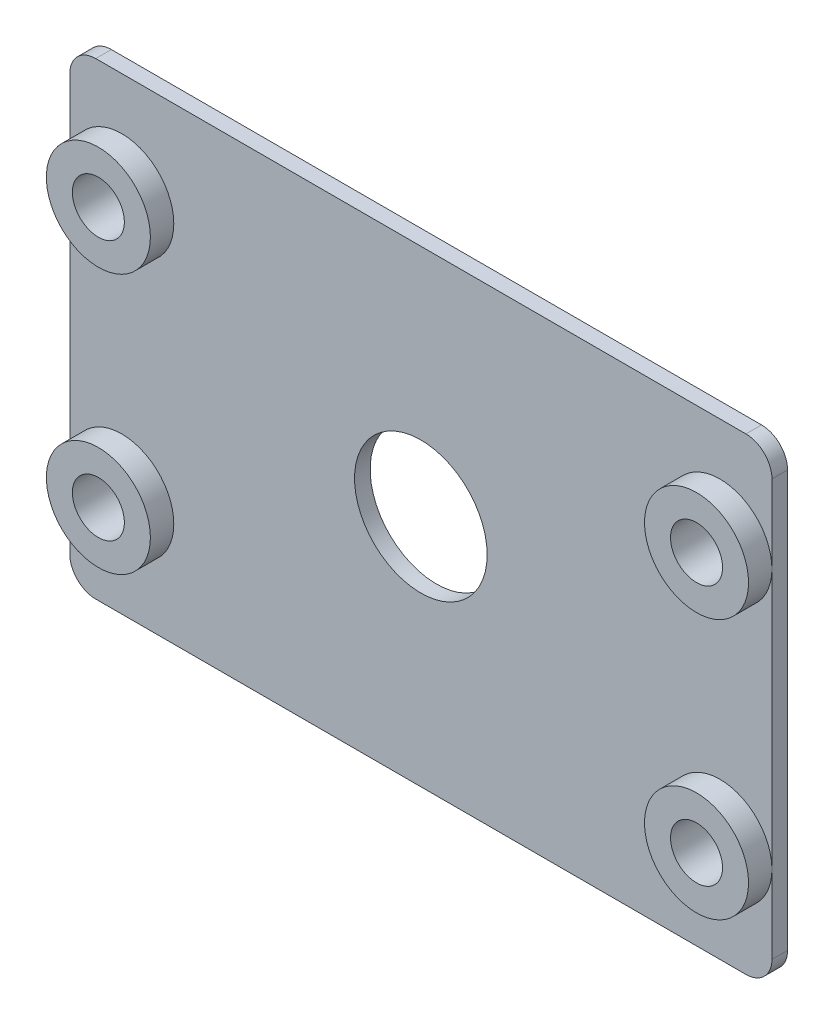
ISO-10303-21;
HEADER;
FILE_DESCRIPTION(('STEP AP214'),'2;1');
FILE_NAME('part.step','',(''),(''),'','','');
FILE_SCHEMA(('AUTOMOTIVE_DESIGN { 1 0 10303 214 1 1 1 1 }'));
ENDSEC;
DATA;
#1=APPLICATION_CONTEXT('core data for automotive mechanical design processes');
#2=APPLICATION_PROTOCOL_DEFINITION('international standard','automotive_design',2000,#1);
#3=PRODUCT_CONTEXT('',#1,'mechanical');
#4=PRODUCT('Part','Part','',(#3));
#5=PRODUCT_RELATED_PRODUCT_CATEGORY('part','',(#4));
#6=PRODUCT_DEFINITION_FORMATION('','',#4);
#7=PRODUCT_DEFINITION_CONTEXT('part definition',#1,'design');
#8=PRODUCT_DEFINITION('design','',#6,#7);
#9=PRODUCT_DEFINITION_SHAPE('','',#8);
#10=(LENGTH_UNIT() NAMED_UNIT(*) SI_UNIT(.MILLI.,.METRE.));
#11=(NAMED_UNIT(*) PLANE_ANGLE_UNIT() SI_UNIT($,.RADIAN.));
#12=(NAMED_UNIT(*) SI_UNIT($,.STERADIAN.) SOLID_ANGLE_UNIT());
#13=UNCERTAINTY_MEASURE_WITH_UNIT(LENGTH_MEASURE(1.E-05),#10,'distance_accuracy_value','');
#14=(GEOMETRIC_REPRESENTATION_CONTEXT(3) GLOBAL_UNCERTAINTY_ASSIGNED_CONTEXT((#13)) GLOBAL_UNIT_ASSIGNED_CONTEXT((#10,
#11,#12)) REPRESENTATION_CONTEXT('',''));
#15=CARTESIAN_POINT('',(0.,0.,0.));
#16=DIRECTION('',(0.,0.,1.));
#17=DIRECTION('',(1.,0.,0.));
#18=AXIS2_PLACEMENT_3D('',#15,#16,#17);
#19=CARTESIAN_POINT('',(-23.,-10.,63.8));
#20=DIRECTION('',(0.,0.,1.));
#21=DIRECTION('',(1.,0.,0.));
#22=AXIS2_PLACEMENT_3D('',#19,#20,#21);
#23=PLANE('',#22);
#24=CARTESIAN_POINT('',(-23.,-10.,63.8));
#25=DIRECTION('',(0.,0.,1.));
#26=DIRECTION('',(1.,0.,0.));
#27=AXIS2_PLACEMENT_3D('',#24,#25,#26);
#28=CIRCLE('',#27,2.);
#29=CARTESIAN_POINT('',(-21.,-10.,63.8));
#30=VERTEX_POINT('',#29);
#31=EDGE_CURVE('E178',#30,#30,#28,.F.);
#32=ORIENTED_EDGE('',*,*,#31,.T.);
#33=EDGE_LOOP('',(#32));
#34=FACE_BOUND('',#33,.T.);
#35=CARTESIAN_POINT('',(-23.,-10.,63.8));
#36=DIRECTION('',(0.,0.,1.));
#37=DIRECTION('',(1.,0.,0.));
#38=AXIS2_PLACEMENT_3D('',#35,#36,#37);
#39=CIRCLE('',#38,4.);
#40=CARTESIAN_POINT('',(-19.,-10.,63.8));
#41=VERTEX_POINT('',#40);
#42=EDGE_CURVE('E19',#41,#41,#39,.F.);
#43=ORIENTED_EDGE('',*,*,#42,.F.);
#44=EDGE_LOOP('',(#43));
#45=FACE_BOUND('',#44,.T.);
#46=ADVANCED_FACE('F16',(#34,#45),#23,.T.);
#47=CARTESIAN_POINT('',(23.,-10.,63.8));
#48=DIRECTION('',(0.,0.,1.));
#49=DIRECTION('',(1.,0.,0.));
#50=AXIS2_PLACEMENT_3D('',#47,#48,#49);
#51=PLANE('',#50);
#52=CARTESIAN_POINT('',(23.,-10.,63.8));
#53=DIRECTION('',(0.,0.,1.));
#54=DIRECTION('',(1.,0.,0.));
#55=AXIS2_PLACEMENT_3D('',#52,#53,#54);
#56=CIRCLE('',#55,2.);
#57=CARTESIAN_POINT('',(25.,-10.,63.8));
#58=VERTEX_POINT('',#57);
#59=EDGE_CURVE('E175',#58,#58,#56,.F.);
#60=ORIENTED_EDGE('',*,*,#59,.T.);
#61=EDGE_LOOP('',(#60));
#62=FACE_BOUND('',#61,.T.);
#63=CARTESIAN_POINT('',(23.,-10.,63.8));
#64=DIRECTION('',(0.,0.,1.));
#65=DIRECTION('',(1.,0.,0.));
#66=AXIS2_PLACEMENT_3D('',#63,#64,#65);
#67=CIRCLE('',#66,4.);
#68=CARTESIAN_POINT('',(27.,-10.,63.8));
#69=VERTEX_POINT('',#68);
#70=EDGE_CURVE('E186',#69,#69,#67,.F.);
#71=ORIENTED_EDGE('',*,*,#70,.F.);
#72=EDGE_LOOP('',(#71));
#73=FACE_BOUND('',#72,.T.);
#74=ADVANCED_FACE('F197',(#62,#73),#51,.T.);
#75=CARTESIAN_POINT('',(-23.,10.,63.8));
#76=DIRECTION('',(0.,0.,1.));
#77=DIRECTION('',(1.,0.,0.));
#78=AXIS2_PLACEMENT_3D('',#75,#76,#77);
#79=PLANE('',#78);
#80=CARTESIAN_POINT('',(-23.,10.,63.8));
#81=DIRECTION('',(0.,0.,1.));
#82=DIRECTION('',(1.,0.,0.));
#83=AXIS2_PLACEMENT_3D('',#80,#81,#82);
#84=CIRCLE('',#83,2.);
#85=CARTESIAN_POINT('',(-21.,10.,63.8));
#86=VERTEX_POINT('',#85);
#87=EDGE_CURVE('E172',#86,#86,#84,.F.);
#88=ORIENTED_EDGE('',*,*,#87,.T.);
#89=EDGE_LOOP('',(#88));
#90=FACE_BOUND('',#89,.T.);
#91=CARTESIAN_POINT('',(-23.,10.,63.8));
#92=DIRECTION('',(0.,0.,1.));
#93=DIRECTION('',(1.,0.,0.));
#94=AXIS2_PLACEMENT_3D('',#91,#92,#93);
#95=CIRCLE('',#94,4.);
#96=CARTESIAN_POINT('',(-19.,10.,63.8));
#97=VERTEX_POINT('',#96);
#98=EDGE_CURVE('E184',#97,#97,#95,.F.);
#99=ORIENTED_EDGE('',*,*,#98,.F.);
#100=EDGE_LOOP('',(#99));
#101=FACE_BOUND('',#100,.T.);
#102=ADVANCED_FACE('F203',(#90,#101),#79,.T.);
#103=CARTESIAN_POINT('',(-23.,-10.,60.8));
#104=DIRECTION('',(0.,0.,1.));
#105=DIRECTION('',(1.,0.,0.));
#106=AXIS2_PLACEMENT_3D('',#103,#104,#105);
#107=CYLINDRICAL_SURFACE('',#106,4.);
#108=ORIENTED_EDGE('',*,*,#42,.T.);
#109=EDGE_LOOP('',(#108));
#110=FACE_BOUND('',#109,.T.);
#111=CARTESIAN_POINT('',(-23.,-10.,62.));
#112=DIRECTION('',(0.,0.,1.));
#113=DIRECTION('',(1.,0.,0.));
#114=AXIS2_PLACEMENT_3D('',#111,#112,#113);
#115=CIRCLE('',#114,4.);
#116=CARTESIAN_POINT('',(-19.,-10.,62.));
#117=VERTEX_POINT('',#116);
#118=EDGE_CURVE('E169',#117,#117,#115,.F.);
#119=ORIENTED_EDGE('',*,*,#118,.F.);
#120=EDGE_LOOP('',(#119));
#121=FACE_BOUND('',#120,.T.);
#122=ADVANCED_FACE('F193',(#110,#121),#107,.T.);
#123=CARTESIAN_POINT('',(23.,-10.,60.8));
#124=DIRECTION('',(0.,0.,1.));
#125=DIRECTION('',(1.,0.,0.));
#126=AXIS2_PLACEMENT_3D('',#123,#124,#125);
#127=CYLINDRICAL_SURFACE('',#126,4.);
#128=ORIENTED_EDGE('',*,*,#70,.T.);
#129=EDGE_LOOP('',(#128));
#130=FACE_BOUND('',#129,.T.);
#131=CARTESIAN_POINT('',(23.,-10.,62.));
#132=DIRECTION('',(0.,0.,1.));
#133=DIRECTION('',(1.,0.,0.));
#134=AXIS2_PLACEMENT_3D('',#131,#132,#133);
#135=CIRCLE('',#134,4.);
#136=CARTESIAN_POINT('',(27.,-10.,62.));
#137=VERTEX_POINT('',#136);
#138=EDGE_CURVE('E166',#137,#137,#135,.F.);
#139=ORIENTED_EDGE('',*,*,#138,.F.);
#140=EDGE_LOOP('',(#139));
#141=FACE_BOUND('',#140,.T.);
#142=ADVANCED_FACE('F275',(#130,#141),#127,.T.);
#143=CARTESIAN_POINT('',(-23.,10.,60.8));
#144=DIRECTION('',(0.,0.,1.));
#145=DIRECTION('',(1.,0.,0.));
#146=AXIS2_PLACEMENT_3D('',#143,#144,#145);
#147=CYLINDRICAL_SURFACE('',#146,4.);
#148=ORIENTED_EDGE('',*,*,#98,.T.);
#149=EDGE_LOOP('',(#148));
#150=FACE_BOUND('',#149,.T.);
#151=CARTESIAN_POINT('',(-23.,10.,62.));
#152=DIRECTION('',(0.,0.,1.));
#153=DIRECTION('',(1.,0.,0.));
#154=AXIS2_PLACEMENT_3D('',#151,#152,#153);
#155=CIRCLE('',#154,4.);
#156=CARTESIAN_POINT('',(-19.,10.,62.));
#157=VERTEX_POINT('',#156);
#158=EDGE_CURVE('E163',#157,#157,#155,.F.);
#159=ORIENTED_EDGE('',*,*,#158,.F.);
#160=EDGE_LOOP('',(#159));
#161=FACE_BOUND('',#160,.T.);
#162=ADVANCED_FACE('F271',(#150,#161),#147,.T.);
#163=CARTESIAN_POINT('',(23.,10.,60.8));
#164=DIRECTION('',(0.,0.,1.));
#165=DIRECTION('',(1.,0.,0.));
#166=AXIS2_PLACEMENT_3D('',#163,#164,#165);
#167=CYLINDRICAL_SURFACE('',#166,4.);
#168=CARTESIAN_POINT('',(23.,10.,63.8));
#169=DIRECTION('',(0.,0.,1.));
#170=DIRECTION('',(1.,0.,0.));
#171=AXIS2_PLACEMENT_3D('',#168,#169,#170);
#172=CIRCLE('',#171,4.);
#173=CARTESIAN_POINT('',(27.,10.,63.8));
#174=VERTEX_POINT('',#173);
#175=EDGE_CURVE('E181',#174,#174,#172,.T.);
#176=ORIENTED_EDGE('',*,*,#175,.F.);
#177=EDGE_LOOP('',(#176));
#178=FACE_BOUND('',#177,.T.);
#179=CARTESIAN_POINT('',(23.,10.,62.));
#180=DIRECTION('',(0.,0.,1.));
#181=DIRECTION('',(1.,0.,0.));
#182=AXIS2_PLACEMENT_3D('',#179,#180,#181);
#183=CIRCLE('',#182,4.);
#184=CARTESIAN_POINT('',(27.,10.,62.));
#185=VERTEX_POINT('',#184);
#186=EDGE_CURVE('E160',#185,#185,#183,.F.);
#187=ORIENTED_EDGE('',*,*,#186,.F.);
#188=EDGE_LOOP('',(#187));
#189=FACE_BOUND('',#188,.T.);
#190=ADVANCED_FACE('F267',(#178,#189),#167,.T.);
#191=CARTESIAN_POINT('',(23.,10.,63.8));
#192=DIRECTION('',(0.,0.,1.));
#193=DIRECTION('',(1.,0.,0.));
#194=AXIS2_PLACEMENT_3D('',#191,#192,#193);
#195=PLANE('',#194);
#196=CARTESIAN_POINT('',(23.,10.,63.8));
#197=DIRECTION('',(0.,0.,1.));
#198=DIRECTION('',(1.,0.,0.));
#199=AXIS2_PLACEMENT_3D('',#196,#197,#198);
#200=CIRCLE('',#199,2.);
#201=CARTESIAN_POINT('',(25.,10.,63.8));
#202=VERTEX_POINT('',#201);
#203=EDGE_CURVE('E91',#202,#202,#200,.F.);
#204=ORIENTED_EDGE('',*,*,#203,.T.);
#205=EDGE_LOOP('',(#204));
#206=FACE_BOUND('',#205,.T.);
#207=ORIENTED_EDGE('',*,*,#175,.T.);
#208=EDGE_LOOP('',(#207));
#209=FACE_BOUND('',#208,.T.);
#210=ADVANCED_FACE('F263',(#206,#209),#195,.T.);
#211=CARTESIAN_POINT('',(-23.,-10.,60.3));
#212=DIRECTION('',(0.,0.,1.));
#213=DIRECTION('',(1.,0.,0.));
#214=AXIS2_PLACEMENT_3D('',#211,#212,#213);
#215=CYLINDRICAL_SURFACE('',#214,2.);
#216=CARTESIAN_POINT('',(-23.,-10.,60.8));
#217=DIRECTION('',(0.,0.,1.));
#218=DIRECTION('',(1.,0.,0.));
#219=AXIS2_PLACEMENT_3D('',#216,#217,#218);
#220=CIRCLE('',#219,2.);
#221=CARTESIAN_POINT('',(-21.,-10.,60.8));
#222=VERTEX_POINT('',#221);
#223=EDGE_CURVE('E138',#222,#222,#220,.F.);
#224=ORIENTED_EDGE('',*,*,#223,.T.);
#225=EDGE_LOOP('',(#224));
#226=FACE_BOUND('',#225,.T.);
#227=ORIENTED_EDGE('',*,*,#31,.F.);
#228=EDGE_LOOP('',(#227));
#229=FACE_BOUND('',#228,.T.);
#230=ADVANCED_FACE('F259',(#226,#229),#215,.F.);
#231=CARTESIAN_POINT('',(23.,-10.,60.3));
#232=DIRECTION('',(0.,0.,1.));
#233=DIRECTION('',(1.,0.,0.));
#234=AXIS2_PLACEMENT_3D('',#231,#232,#233);
#235=CYLINDRICAL_SURFACE('',#234,2.);
#236=CARTESIAN_POINT('',(23.,-10.,60.8));
#237=DIRECTION('',(0.,0.,1.));
#238=DIRECTION('',(1.,0.,0.));
#239=AXIS2_PLACEMENT_3D('',#236,#237,#238);
#240=CIRCLE('',#239,2.);
#241=CARTESIAN_POINT('',(25.,-10.,60.8));
#242=VERTEX_POINT('',#241);
#243=EDGE_CURVE('E135',#242,#242,#240,.F.);
#244=ORIENTED_EDGE('',*,*,#243,.T.);
#245=EDGE_LOOP('',(#244));
#246=FACE_BOUND('',#245,.T.);
#247=ORIENTED_EDGE('',*,*,#59,.F.);
#248=EDGE_LOOP('',(#247));
#249=FACE_BOUND('',#248,.T.);
#250=ADVANCED_FACE('F255',(#246,#249),#235,.F.);
#251=CARTESIAN_POINT('',(-23.,10.,60.3));
#252=DIRECTION('',(0.,0.,1.));
#253=DIRECTION('',(1.,0.,0.));
#254=AXIS2_PLACEMENT_3D('',#251,#252,#253);
#255=CYLINDRICAL_SURFACE('',#254,2.);
#256=CARTESIAN_POINT('',(-23.,10.,60.8));
#257=DIRECTION('',(0.,0.,1.));
#258=DIRECTION('',(1.,0.,0.));
#259=AXIS2_PLACEMENT_3D('',#256,#257,#258);
#260=CIRCLE('',#259,2.);
#261=CARTESIAN_POINT('',(-21.,10.,60.8));
#262=VERTEX_POINT('',#261);
#263=EDGE_CURVE('E132',#262,#262,#260,.F.);
#264=ORIENTED_EDGE('',*,*,#263,.T.);
#265=EDGE_LOOP('',(#264));
#266=FACE_BOUND('',#265,.T.);
#267=ORIENTED_EDGE('',*,*,#87,.F.);
#268=EDGE_LOOP('',(#267));
#269=FACE_BOUND('',#268,.T.);
#270=ADVANCED_FACE('F251',(#266,#269),#255,.F.);
#271=CARTESIAN_POINT('',(0.,0.,62.));
#272=DIRECTION('',(0.,0.,1.));
#273=DIRECTION('',(1.,0.,0.));
#274=AXIS2_PLACEMENT_3D('',#271,#272,#273);
#275=PLANE('',#274);
#276=ORIENTED_EDGE('',*,*,#186,.T.);
#277=EDGE_LOOP('',(#276));
#278=FACE_BOUND('',#277,.T.);
#279=CARTESIAN_POINT('',(0.,0.,62.));
#280=DIRECTION('',(0.,0.,1.));
#281=DIRECTION('',(1.,0.,0.));
#282=AXIS2_PLACEMENT_3D('',#279,#280,#281);
#283=CIRCLE('',#282,5.1);
#284=CARTESIAN_POINT('',(5.1,0.,62.));
#285=VERTEX_POINT('',#284);
#286=EDGE_CURVE('E129',#285,#285,#283,.F.);
#287=ORIENTED_EDGE('',*,*,#286,.T.);
#288=EDGE_LOOP('',(#287));
#289=FACE_BOUND('',#288,.T.);
#290=ORIENTED_EDGE('',*,*,#158,.T.);
#291=EDGE_LOOP('',(#290));
#292=FACE_BOUND('',#291,.T.);
#293=ORIENTED_EDGE('',*,*,#138,.T.);
#294=EDGE_LOOP('',(#293));
#295=FACE_BOUND('',#294,.T.);
#296=ORIENTED_EDGE('',*,*,#118,.T.);
#297=EDGE_LOOP('',(#296));
#298=FACE_BOUND('',#297,.T.);
#299=CARTESIAN_POINT('',(-25.,16.,62.));
#300=DIRECTION('',(0.,0.,1.));
#301=DIRECTION('',(1.,0.,0.));
#302=AXIS2_PLACEMENT_3D('',#299,#300,#301);
#303=CIRCLE('',#302,2.);
#304=CARTESIAN_POINT('',(-27.,16.,62.));
#305=VERTEX_POINT('',#304);
#306=CARTESIAN_POINT('',(-25.,18.,62.));
#307=VERTEX_POINT('',#306);
#308=EDGE_CURVE('E143',#305,#307,#303,.F.);
#309=ORIENTED_EDGE('',*,*,#308,.F.);
#310=DIRECTION('',(0.,1.,0.));
#311=VECTOR('',#310,1.);
#312=CARTESIAN_POINT('',(-27.,0.,62.));
#313=LINE('',#312,#311);
#314=CARTESIAN_POINT('',(-27.,-16.,62.));
#315=VERTEX_POINT('',#314);
#316=EDGE_CURVE('E85',#305,#315,#313,.F.);
#317=ORIENTED_EDGE('',*,*,#316,.T.);
#318=CARTESIAN_POINT('',(-25.,-16.,62.));
#319=DIRECTION('',(0.,0.,1.));
#320=DIRECTION('',(1.,0.,0.));
#321=AXIS2_PLACEMENT_3D('',#318,#319,#320);
#322=CIRCLE('',#321,2.);
#323=CARTESIAN_POINT('',(-25.,-18.,62.));
#324=VERTEX_POINT('',#323);
#325=EDGE_CURVE('E78',#324,#315,#322,.F.);
#326=ORIENTED_EDGE('',*,*,#325,.F.);
#327=DIRECTION('',(1.,0.,0.));
#328=VECTOR('',#327,1.);
#329=CARTESIAN_POINT('',(0.,-18.,62.));
#330=LINE('',#329,#328);
#331=CARTESIAN_POINT('',(25.,-18.,62.));
#332=VERTEX_POINT('',#331);
#333=EDGE_CURVE('E83',#324,#332,#330,.T.);
#334=ORIENTED_EDGE('',*,*,#333,.T.);
#335=CARTESIAN_POINT('',(25.,-16.,62.));
#336=DIRECTION('',(0.,0.,1.));
#337=DIRECTION('',(1.,0.,0.));
#338=AXIS2_PLACEMENT_3D('',#335,#336,#337);
#339=CIRCLE('',#338,2.);
#340=CARTESIAN_POINT('',(27.,-16.,62.));
#341=VERTEX_POINT('',#340);
#342=EDGE_CURVE('E98',#341,#332,#339,.F.);
#343=ORIENTED_EDGE('',*,*,#342,.F.);
#344=DIRECTION('',(0.,1.,0.));
#345=VECTOR('',#344,1.);
#346=CARTESIAN_POINT('',(27.,0.,62.));
#347=LINE('',#346,#345);
#348=CARTESIAN_POINT('',(27.,16.,62.));
#349=VERTEX_POINT('',#348);
#350=EDGE_CURVE('E153',#341,#349,#347,.T.);
#351=ORIENTED_EDGE('',*,*,#350,.T.);
#352=CARTESIAN_POINT('',(25.,16.,62.));
#353=DIRECTION('',(0.,0.,1.));
#354=DIRECTION('',(1.,0.,0.));
#355=AXIS2_PLACEMENT_3D('',#352,#353,#354);
#356=CIRCLE('',#355,2.);
#357=CARTESIAN_POINT('',(25.,18.,62.));
#358=VERTEX_POINT('',#357);
#359=EDGE_CURVE('E150',#358,#349,#356,.F.);
#360=ORIENTED_EDGE('',*,*,#359,.F.);
#361=DIRECTION('',(1.,0.,0.));
#362=VECTOR('',#361,1.);
#363=CARTESIAN_POINT('',(0.,18.,62.));
#364=LINE('',#363,#362);
#365=EDGE_CURVE('E146',#358,#307,#364,.F.);
#366=ORIENTED_EDGE('',*,*,#365,.T.);
#367=EDGE_LOOP('',(#309,#317,#326,#334,#343,#351,#360,#366));
#368=FACE_BOUND('',#367,.T.);
#369=ADVANCED_FACE('F81',(#278,#289,#292,#295,#298,#368),#275,.T.);
#370=CARTESIAN_POINT('',(23.,10.,60.3));
#371=DIRECTION('',(0.,0.,1.));
#372=DIRECTION('',(1.,0.,0.));
#373=AXIS2_PLACEMENT_3D('',#370,#371,#372);
#374=CYLINDRICAL_SURFACE('',#373,2.);
#375=CARTESIAN_POINT('',(23.,10.,60.8));
#376=DIRECTION('',(0.,0.,1.));
#377=DIRECTION('',(1.,0.,0.));
#378=AXIS2_PLACEMENT_3D('',#375,#376,#377);
#379=CIRCLE('',#378,2.);
#380=CARTESIAN_POINT('',(25.,10.,60.8));
#381=VERTEX_POINT('',#380);
#382=EDGE_CURVE('E126',#381,#381,#379,.F.);
#383=ORIENTED_EDGE('',*,*,#382,.T.);
#384=EDGE_LOOP('',(#383));
#385=FACE_BOUND('',#384,.T.);
#386=ORIENTED_EDGE('',*,*,#203,.F.);
#387=EDGE_LOOP('',(#386));
#388=FACE_BOUND('',#387,.T.);
#389=ADVANCED_FACE('F245',(#385,#388),#374,.F.);
#390=CARTESIAN_POINT('',(-25.,-16.,60.8));
#391=DIRECTION('',(0.,0.,1.));
#392=DIRECTION('',(1.,0.,0.));
#393=AXIS2_PLACEMENT_3D('',#390,#391,#392);
#394=CYLINDRICAL_SURFACE('',#393,2.);
#395=DIRECTION('',(0.,0.,-1.));
#396=VECTOR('',#395,1.);
#397=CARTESIAN_POINT('',(-27.,-16.,60.8));
#398=LINE('',#397,#396);
#399=CARTESIAN_POINT('',(-27.,-16.,60.8));
#400=VERTEX_POINT('',#399);
#401=EDGE_CURVE('E141',#315,#400,#398,.T.);
#402=ORIENTED_EDGE('',*,*,#401,.T.);
#403=CARTESIAN_POINT('',(-25.,-16.,60.8));
#404=DIRECTION('',(0.,0.,1.));
#405=DIRECTION('',(1.,0.,0.));
#406=AXIS2_PLACEMENT_3D('',#403,#404,#405);
#407=CIRCLE('',#406,2.);
#408=CARTESIAN_POINT('',(-25.,-18.,60.8));
#409=VERTEX_POINT('',#408);
#410=EDGE_CURVE('E103',#400,#409,#407,.T.);
#411=ORIENTED_EDGE('',*,*,#410,.T.);
#412=DIRECTION('',(0.,0.,1.));
#413=VECTOR('',#412,1.);
#414=CARTESIAN_POINT('',(-25.,-18.,60.8));
#415=LINE('',#414,#413);
#416=EDGE_CURVE('E90',#409,#324,#415,.T.);
#417=ORIENTED_EDGE('',*,*,#416,.T.);
#418=ORIENTED_EDGE('',*,*,#325,.T.);
#419=EDGE_LOOP('',(#402,#411,#417,#418));
#420=FACE_BOUND('',#419,.T.);
#421=ADVANCED_FACE('F101',(#420),#394,.T.);
#422=CARTESIAN_POINT('',(-27.,-18.,60.8));
#423=DIRECTION('',(0.,1.,0.));
#424=DIRECTION('',(0.,0.,1.));
#425=AXIS2_PLACEMENT_3D('',#422,#423,#424);
#426=PLANE('',#425);
#427=ORIENTED_EDGE('',*,*,#333,.F.);
#428=ORIENTED_EDGE('',*,*,#416,.F.);
#429=DIRECTION('',(1.,0.,0.));
#430=VECTOR('',#429,1.);
#431=CARTESIAN_POINT('',(-27.,-18.,60.8));
#432=LINE('',#431,#430);
#433=CARTESIAN_POINT('',(25.,-18.,60.8));
#434=VERTEX_POINT('',#433);
#435=EDGE_CURVE('E123',#409,#434,#432,.T.);
#436=ORIENTED_EDGE('',*,*,#435,.T.);
#437=DIRECTION('',(0.,0.,1.));
#438=VECTOR('',#437,1.);
#439=CARTESIAN_POINT('',(25.,-18.,60.8));
#440=LINE('',#439,#438);
#441=EDGE_CURVE('E97',#332,#434,#440,.F.);
#442=ORIENTED_EDGE('',*,*,#441,.F.);
#443=EDGE_LOOP('',(#427,#428,#436,#442));
#444=FACE_BOUND('',#443,.T.);
#445=ADVANCED_FACE('F94',(#444),#426,.F.);
#446=CARTESIAN_POINT('',(25.,-16.,60.8));
#447=DIRECTION('',(0.,0.,1.));
#448=DIRECTION('',(1.,0.,0.));
#449=AXIS2_PLACEMENT_3D('',#446,#447,#448);
#450=CYLINDRICAL_SURFACE('',#449,2.);
#451=ORIENTED_EDGE('',*,*,#342,.T.);
#452=ORIENTED_EDGE('',*,*,#441,.T.);
#453=CARTESIAN_POINT('',(25.,-16.,60.8));
#454=DIRECTION('',(0.,0.,1.));
#455=DIRECTION('',(1.,0.,0.));
#456=AXIS2_PLACEMENT_3D('',#453,#454,#455);
#457=CIRCLE('',#456,2.);
#458=CARTESIAN_POINT('',(27.,-16.,60.8));
#459=VERTEX_POINT('',#458);
#460=EDGE_CURVE('E120',#434,#459,#457,.T.);
#461=ORIENTED_EDGE('',*,*,#460,.T.);
#462=DIRECTION('',(0.,0.,1.));
#463=VECTOR('',#462,1.);
#464=CARTESIAN_POINT('',(27.,-16.,60.8));
#465=LINE('',#464,#463);
#466=EDGE_CURVE('E156',#459,#341,#465,.T.);
#467=ORIENTED_EDGE('',*,*,#466,.T.);
#468=EDGE_LOOP('',(#451,#452,#461,#467));
#469=FACE_BOUND('',#468,.T.);
#470=ADVANCED_FACE('F236',(#469),#450,.T.);
#471=CARTESIAN_POINT('',(27.,-18.,60.8));
#472=DIRECTION('',(-1.,0.,0.));
#473=DIRECTION('',(0.,0.,1.));
#474=AXIS2_PLACEMENT_3D('',#471,#472,#473);
#475=PLANE('',#474);
#476=ORIENTED_EDGE('',*,*,#350,.F.);
#477=ORIENTED_EDGE('',*,*,#466,.F.);
#478=DIRECTION('',(0.,1.,0.));
#479=VECTOR('',#478,1.);
#480=CARTESIAN_POINT('',(27.,-18.,60.8));
#481=LINE('',#480,#479);
#482=CARTESIAN_POINT('',(27.,16.,60.8));
#483=VERTEX_POINT('',#482);
#484=EDGE_CURVE('E118',#459,#483,#481,.T.);
#485=ORIENTED_EDGE('',*,*,#484,.T.);
#486=DIRECTION('',(0.,0.,1.));
#487=VECTOR('',#486,1.);
#488=CARTESIAN_POINT('',(27.,16.,60.8));
#489=LINE('',#488,#487);
#490=EDGE_CURVE('E152',#349,#483,#489,.F.);
#491=ORIENTED_EDGE('',*,*,#490,.F.);
#492=EDGE_LOOP('',(#476,#477,#485,#491));
#493=FACE_BOUND('',#492,.T.);
#494=ADVANCED_FACE('F232',(#493),#475,.F.);
#495=CARTESIAN_POINT('',(25.,16.,60.8));
#496=DIRECTION('',(0.,0.,1.));
#497=DIRECTION('',(1.,0.,0.));
#498=AXIS2_PLACEMENT_3D('',#495,#496,#497);
#499=CYLINDRICAL_SURFACE('',#498,2.);
#500=ORIENTED_EDGE('',*,*,#359,.T.);
#501=ORIENTED_EDGE('',*,*,#490,.T.);
#502=CARTESIAN_POINT('',(25.,16.,60.8));
#503=DIRECTION('',(0.,0.,1.));
#504=DIRECTION('',(1.,0.,0.));
#505=AXIS2_PLACEMENT_3D('',#502,#503,#504);
#506=CIRCLE('',#505,2.);
#507=CARTESIAN_POINT('',(25.,18.,60.8));
#508=VERTEX_POINT('',#507);
#509=EDGE_CURVE('E115',#483,#508,#506,.T.);
#510=ORIENTED_EDGE('',*,*,#509,.T.);
#511=DIRECTION('',(0.,0.,-1.));
#512=VECTOR('',#511,1.);
#513=CARTESIAN_POINT('',(25.,18.,60.8));
#514=LINE('',#513,#512);
#515=EDGE_CURVE('E149',#508,#358,#514,.F.);
#516=ORIENTED_EDGE('',*,*,#515,.T.);
#517=EDGE_LOOP('',(#500,#501,#510,#516));
#518=FACE_BOUND('',#517,.T.);
#519=ADVANCED_FACE('F228',(#518),#499,.T.);
#520=CARTESIAN_POINT('',(27.,18.,60.8));
#521=DIRECTION('',(0.,-1.,0.));
#522=DIRECTION('',(0.,0.,-1.));
#523=AXIS2_PLACEMENT_3D('',#520,#521,#522);
#524=PLANE('',#523);
#525=ORIENTED_EDGE('',*,*,#365,.F.);
#526=ORIENTED_EDGE('',*,*,#515,.F.);
#527=DIRECTION('',(1.,0.,0.));
#528=VECTOR('',#527,1.);
#529=CARTESIAN_POINT('',(27.,18.,60.8));
#530=LINE('',#529,#528);
#531=CARTESIAN_POINT('',(-25.,18.,60.8));
#532=VERTEX_POINT('',#531);
#533=EDGE_CURVE('E112',#508,#532,#530,.F.);
#534=ORIENTED_EDGE('',*,*,#533,.T.);
#535=DIRECTION('',(0.,0.,1.));
#536=VECTOR('',#535,1.);
#537=CARTESIAN_POINT('',(-25.,18.,60.8));
#538=LINE('',#537,#536);
#539=EDGE_CURVE('E145',#307,#532,#538,.F.);
#540=ORIENTED_EDGE('',*,*,#539,.F.);
#541=EDGE_LOOP('',(#525,#526,#534,#540));
#542=FACE_BOUND('',#541,.T.);
#543=ADVANCED_FACE('F224',(#542),#524,.F.);
#544=CARTESIAN_POINT('',(-25.,16.,60.8));
#545=DIRECTION('',(0.,0.,1.));
#546=DIRECTION('',(1.,0.,0.));
#547=AXIS2_PLACEMENT_3D('',#544,#545,#546);
#548=CYLINDRICAL_SURFACE('',#547,2.);
#549=ORIENTED_EDGE('',*,*,#308,.T.);
#550=ORIENTED_EDGE('',*,*,#539,.T.);
#551=CARTESIAN_POINT('',(-25.,16.,60.8));
#552=DIRECTION('',(0.,0.,1.));
#553=DIRECTION('',(1.,0.,0.));
#554=AXIS2_PLACEMENT_3D('',#551,#552,#553);
#555=CIRCLE('',#554,2.);
#556=CARTESIAN_POINT('',(-27.,16.,60.8));
#557=VERTEX_POINT('',#556);
#558=EDGE_CURVE('E109',#532,#557,#555,.T.);
#559=ORIENTED_EDGE('',*,*,#558,.T.);
#560=DIRECTION('',(0.,0.,-1.));
#561=VECTOR('',#560,1.);
#562=CARTESIAN_POINT('',(-27.,16.,60.8));
#563=LINE('',#562,#561);
#564=EDGE_CURVE('E34',#557,#305,#563,.F.);
#565=ORIENTED_EDGE('',*,*,#564,.T.);
#566=EDGE_LOOP('',(#549,#550,#559,#565));
#567=FACE_BOUND('',#566,.T.);
#568=ADVANCED_FACE('F221',(#567),#548,.T.);
#569=CARTESIAN_POINT('',(-27.,18.,60.8));
#570=DIRECTION('',(1.,0.,0.));
#571=DIRECTION('',(0.,0.,-1.));
#572=AXIS2_PLACEMENT_3D('',#569,#570,#571);
#573=PLANE('',#572);
#574=ORIENTED_EDGE('',*,*,#316,.F.);
#575=ORIENTED_EDGE('',*,*,#564,.F.);
#576=DIRECTION('',(0.,1.,0.));
#577=VECTOR('',#576,1.);
#578=CARTESIAN_POINT('',(-27.,18.,60.8));
#579=LINE('',#578,#577);
#580=EDGE_CURVE('E25',#557,#400,#579,.F.);
#581=ORIENTED_EDGE('',*,*,#580,.T.);
#582=ORIENTED_EDGE('',*,*,#401,.F.);
#583=EDGE_LOOP('',(#574,#575,#581,#582));
#584=FACE_BOUND('',#583,.T.);
#585=ADVANCED_FACE('F213',(#584),#573,.F.);
#586=CARTESIAN_POINT('',(0.,0.,59.8));
#587=DIRECTION('',(0.,0.,1.));
#588=DIRECTION('',(1.,0.,0.));
#589=AXIS2_PLACEMENT_3D('',#586,#587,#588);
#590=CYLINDRICAL_SURFACE('',#589,5.1);
#591=CARTESIAN_POINT('',(0.,0.,60.8));
#592=DIRECTION('',(0.,0.,1.));
#593=DIRECTION('',(1.,0.,0.));
#594=AXIS2_PLACEMENT_3D('',#591,#592,#593);
#595=CIRCLE('',#594,5.1);
#596=CARTESIAN_POINT('',(5.1,0.,60.8));
#597=VERTEX_POINT('',#596);
#598=EDGE_CURVE('E10',#597,#597,#595,.F.);
#599=ORIENTED_EDGE('',*,*,#598,.T.);
#600=EDGE_LOOP('',(#599));
#601=FACE_BOUND('',#600,.T.);
#602=ORIENTED_EDGE('',*,*,#286,.F.);
#603=EDGE_LOOP('',(#602));
#604=FACE_BOUND('',#603,.T.);
#605=ADVANCED_FACE('F207',(#601,#604),#590,.F.);
#606=CARTESIAN_POINT('',(0.,0.,60.8));
#607=DIRECTION('',(0.,0.,1.));
#608=DIRECTION('',(1.,0.,0.));
#609=AXIS2_PLACEMENT_3D('',#606,#607,#608);
#610=PLANE('',#609);
#611=ORIENTED_EDGE('',*,*,#598,.F.);
#612=EDGE_LOOP('',(#611));
#613=FACE_BOUND('',#612,.T.);
#614=ORIENTED_EDGE('',*,*,#410,.F.);
#615=ORIENTED_EDGE('',*,*,#580,.F.);
#616=ORIENTED_EDGE('',*,*,#558,.F.);
#617=ORIENTED_EDGE('',*,*,#533,.F.);
#618=ORIENTED_EDGE('',*,*,#509,.F.);
#619=ORIENTED_EDGE('',*,*,#484,.F.);
#620=ORIENTED_EDGE('',*,*,#460,.F.);
#621=ORIENTED_EDGE('',*,*,#435,.F.);
#622=EDGE_LOOP('',(#614,#615,#616,#617,#618,#619,#620,#621));
#623=FACE_BOUND('',#622,.T.);
#624=ORIENTED_EDGE('',*,*,#382,.F.);
#625=EDGE_LOOP('',(#624));
#626=FACE_BOUND('',#625,.T.);
#627=ORIENTED_EDGE('',*,*,#263,.F.);
#628=EDGE_LOOP('',(#627));
#629=FACE_BOUND('',#628,.T.);
#630=ORIENTED_EDGE('',*,*,#243,.F.);
#631=EDGE_LOOP('',(#630));
#632=FACE_BOUND('',#631,.T.);
#633=ORIENTED_EDGE('',*,*,#223,.F.);
#634=EDGE_LOOP('',(#633));
#635=FACE_BOUND('',#634,.T.);
#636=ADVANCED_FACE('F205',(#613,#623,#626,#629,#632,#635),#610,.F.);
#637=CLOSED_SHELL('',(#46,#74,#102,#122,#142,#162,#190,#210,#230,#250,#270,#369,#389,#421,#445,
#470,#494,#519,#543,#568,#585,#605,#636));
#638=MANIFOLD_SOLID_BREP('B1',#637);
#639=ADVANCED_BREP_SHAPE_REPRESENTATION('',(#18,#638),#14);
#640=SHAPE_DEFINITION_REPRESENTATION(#9,#639);
ENDSEC;
END-ISO-10303-21;
